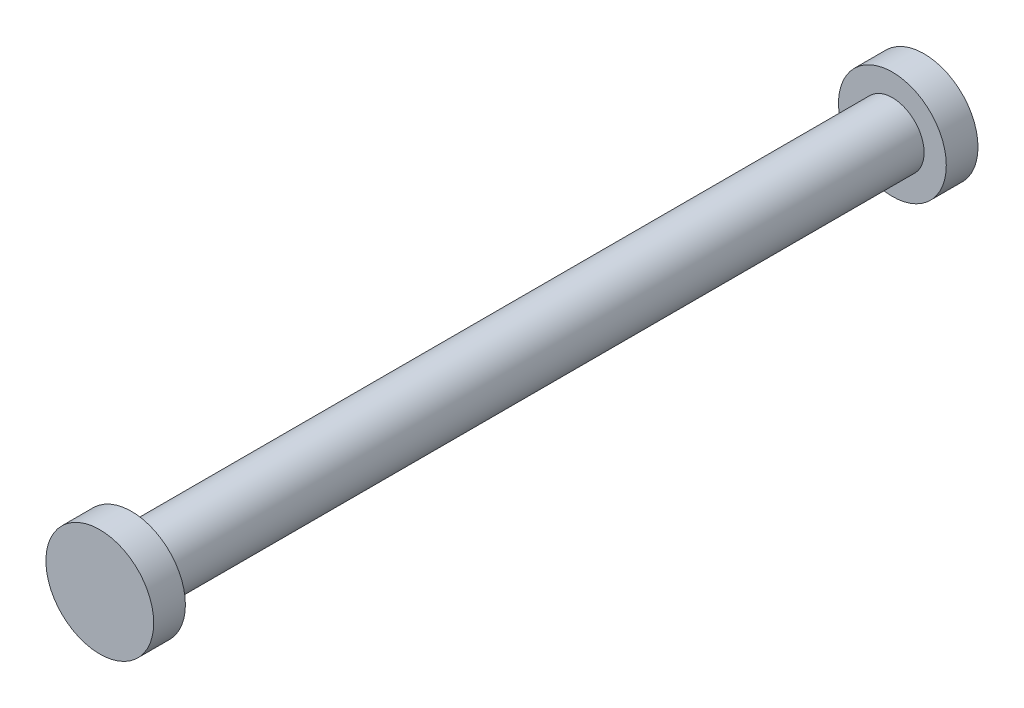
ISO-10303-21;
HEADER;
FILE_DESCRIPTION(('STEP AP214'),'2;1');
FILE_NAME('part.step','',(''),(''),'','','');
FILE_SCHEMA(('AUTOMOTIVE_DESIGN { 1 0 10303 214 1 1 1 1 }'));
ENDSEC;
DATA;
#1=APPLICATION_CONTEXT('core data for automotive mechanical design processes');
#2=APPLICATION_PROTOCOL_DEFINITION('international standard','automotive_design',2000,#1);
#3=PRODUCT_CONTEXT('',#1,'mechanical');
#4=PRODUCT('Part','Part','',(#3));
#5=PRODUCT_RELATED_PRODUCT_CATEGORY('part','',(#4));
#6=PRODUCT_DEFINITION_FORMATION('','',#4);
#7=PRODUCT_DEFINITION_CONTEXT('part definition',#1,'design');
#8=PRODUCT_DEFINITION('design','',#6,#7);
#9=PRODUCT_DEFINITION_SHAPE('','',#8);
#10=(LENGTH_UNIT() NAMED_UNIT(*) SI_UNIT(.MILLI.,.METRE.));
#11=(NAMED_UNIT(*) PLANE_ANGLE_UNIT() SI_UNIT($,.RADIAN.));
#12=(NAMED_UNIT(*) SI_UNIT($,.STERADIAN.) SOLID_ANGLE_UNIT());
#13=UNCERTAINTY_MEASURE_WITH_UNIT(LENGTH_MEASURE(1.E-05),#10,'distance_accuracy_value','');
#14=(GEOMETRIC_REPRESENTATION_CONTEXT(3) GLOBAL_UNCERTAINTY_ASSIGNED_CONTEXT((#13)) GLOBAL_UNIT_ASSIGNED_CONTEXT((#10,
#11,#12)) REPRESENTATION_CONTEXT('',''));
#15=CARTESIAN_POINT('',(0.,0.,0.));
#16=DIRECTION('',(0.,0.,1.));
#17=DIRECTION('',(1.,0.,0.));
#18=AXIS2_PLACEMENT_3D('',#15,#16,#17);
#19=CARTESIAN_POINT('',(-425.1,65.,-65.));
#20=DIRECTION('',(0.,0.,1.));
#21=DIRECTION('',(1.,0.,0.));
#22=AXIS2_PLACEMENT_3D('',#19,#20,#21);
#23=CYLINDRICAL_SURFACE('',#22,5.);
#24=CARTESIAN_POINT('',(-425.1,65.,-60.));
#25=DIRECTION('',(0.,0.,1.));
#26=DIRECTION('',(1.,0.,0.));
#27=AXIS2_PLACEMENT_3D('',#24,#25,#26);
#28=CIRCLE('',#27,5.);
#29=CARTESIAN_POINT('',(-420.1,65.,-60.));
#30=VERTEX_POINT('',#29);
#31=EDGE_CURVE('E11',#30,#30,#28,.F.);
#32=ORIENTED_EDGE('',*,*,#31,.F.);
#33=EDGE_LOOP('',(#32));
#34=FACE_BOUND('',#33,.T.);
#35=CARTESIAN_POINT('',(-425.1,65.,60.));
#36=DIRECTION('',(0.,0.,1.));
#37=DIRECTION('',(1.,0.,0.));
#38=AXIS2_PLACEMENT_3D('',#35,#36,#37);
#39=CIRCLE('',#38,5.);
#40=CARTESIAN_POINT('',(-420.1,65.,60.));
#41=VERTEX_POINT('',#40);
#42=EDGE_CURVE('E56',#41,#41,#39,.F.);
#43=ORIENTED_EDGE('',*,*,#42,.T.);
#44=EDGE_LOOP('',(#43));
#45=FACE_BOUND('',#44,.T.);
#46=ADVANCED_FACE('F49',(#34,#45),#23,.T.);
#47=CARTESIAN_POINT('',(-425.1,65.,60.));
#48=DIRECTION('',(0.,0.,1.));
#49=DIRECTION('',(1.,0.,0.));
#50=AXIS2_PLACEMENT_3D('',#47,#48,#49);
#51=PLANE('',#50);
#52=ORIENTED_EDGE('',*,*,#42,.F.);
#53=EDGE_LOOP('',(#52));
#54=FACE_BOUND('',#53,.T.);
#55=CARTESIAN_POINT('',(-425.1,65.,60.));
#56=DIRECTION('',(0.,0.,1.));
#57=DIRECTION('',(1.,0.,0.));
#58=AXIS2_PLACEMENT_3D('',#55,#56,#57);
#59=CIRCLE('',#58,8.50000000000001);
#60=CARTESIAN_POINT('',(-416.6,65.,60.));
#61=VERTEX_POINT('',#60);
#62=EDGE_CURVE('E64',#61,#61,#59,.T.);
#63=ORIENTED_EDGE('',*,*,#62,.F.);
#64=EDGE_LOOP('',(#63));
#65=FACE_BOUND('',#64,.T.);
#66=ADVANCED_FACE('F89',(#54,#65),#51,.F.);
#67=CARTESIAN_POINT('',(-425.1,65.,60.));
#68=DIRECTION('',(0.,0.,1.));
#69=DIRECTION('',(1.,0.,0.));
#70=AXIS2_PLACEMENT_3D('',#67,#68,#69);
#71=CYLINDRICAL_SURFACE('',#70,8.50000000000001);
#72=CARTESIAN_POINT('',(-425.1,65.,65.));
#73=DIRECTION('',(0.,0.,1.));
#74=DIRECTION('',(1.,0.,0.));
#75=AXIS2_PLACEMENT_3D('',#72,#73,#74);
#76=CIRCLE('',#75,8.50000000000001);
#77=CARTESIAN_POINT('',(-416.6,65.,65.));
#78=VERTEX_POINT('',#77);
#79=EDGE_CURVE('E60',#78,#78,#76,.T.);
#80=ORIENTED_EDGE('',*,*,#79,.F.);
#81=EDGE_LOOP('',(#80));
#82=FACE_BOUND('',#81,.T.);
#83=ORIENTED_EDGE('',*,*,#62,.T.);
#84=EDGE_LOOP('',(#83));
#85=FACE_BOUND('',#84,.T.);
#86=ADVANCED_FACE('F92',(#82,#85),#71,.T.);
#87=CARTESIAN_POINT('',(-425.1,65.,65.));
#88=DIRECTION('',(0.,0.,1.));
#89=DIRECTION('',(1.,0.,0.));
#90=AXIS2_PLACEMENT_3D('',#87,#88,#89);
#91=PLANE('',#90);
#92=ORIENTED_EDGE('',*,*,#79,.T.);
#93=EDGE_LOOP('',(#92));
#94=FACE_BOUND('',#93,.T.);
#95=ADVANCED_FACE('F85',(#94),#91,.T.);
#96=CARTESIAN_POINT('',(-425.1,65.,-60.));
#97=DIRECTION('',(0.,0.,1.));
#98=DIRECTION('',(1.,0.,0.));
#99=AXIS2_PLACEMENT_3D('',#96,#97,#98);
#100=PLANE('',#99);
#101=ORIENTED_EDGE('',*,*,#31,.T.);
#102=EDGE_LOOP('',(#101));
#103=FACE_BOUND('',#102,.T.);
#104=CARTESIAN_POINT('',(-425.1,65.,-60.));
#105=DIRECTION('',(0.,0.,1.));
#106=DIRECTION('',(1.,0.,0.));
#107=AXIS2_PLACEMENT_3D('',#104,#105,#106);
#108=CIRCLE('',#107,8.50000000000001);
#109=CARTESIAN_POINT('',(-416.6,65.,-60.));
#110=VERTEX_POINT('',#109);
#111=EDGE_CURVE('E69',#110,#110,#108,.T.);
#112=ORIENTED_EDGE('',*,*,#111,.T.);
#113=EDGE_LOOP('',(#112));
#114=FACE_BOUND('',#113,.T.);
#115=ADVANCED_FACE('F79',(#103,#114),#100,.T.);
#116=CARTESIAN_POINT('',(-425.1,65.,-65.));
#117=DIRECTION('',(0.,0.,1.));
#118=DIRECTION('',(1.,0.,0.));
#119=AXIS2_PLACEMENT_3D('',#116,#117,#118);
#120=CYLINDRICAL_SURFACE('',#119,8.50000000000001);
#121=ORIENTED_EDGE('',*,*,#111,.F.);
#122=EDGE_LOOP('',(#121));
#123=FACE_BOUND('',#122,.T.);
#124=CARTESIAN_POINT('',(-425.1,65.,-65.));
#125=DIRECTION('',(0.,0.,1.));
#126=DIRECTION('',(1.,0.,0.));
#127=AXIS2_PLACEMENT_3D('',#124,#125,#126);
#128=CIRCLE('',#127,8.50000000000001);
#129=CARTESIAN_POINT('',(-416.6,65.,-65.));
#130=VERTEX_POINT('',#129);
#131=EDGE_CURVE('E72',#130,#130,#128,.T.);
#132=ORIENTED_EDGE('',*,*,#131,.T.);
#133=EDGE_LOOP('',(#132));
#134=FACE_BOUND('',#133,.T.);
#135=ADVANCED_FACE('F76',(#123,#134),#120,.T.);
#136=CARTESIAN_POINT('',(-425.1,65.,-65.));
#137=DIRECTION('',(0.,0.,1.));
#138=DIRECTION('',(1.,0.,0.));
#139=AXIS2_PLACEMENT_3D('',#136,#137,#138);
#140=PLANE('',#139);
#141=ORIENTED_EDGE('',*,*,#131,.F.);
#142=EDGE_LOOP('',(#141));
#143=FACE_BOUND('',#142,.T.);
#144=ADVANCED_FACE('F51',(#143),#140,.F.);
#145=CLOSED_SHELL('',(#46,#66,#86,#95,#115,#135,#144));
#146=MANIFOLD_SOLID_BREP('B2',#145);
#147=ADVANCED_BREP_SHAPE_REPRESENTATION('',(#18,#146),#14);
#148=SHAPE_DEFINITION_REPRESENTATION(#9,#147);
ENDSEC;
END-ISO-10303-21;
